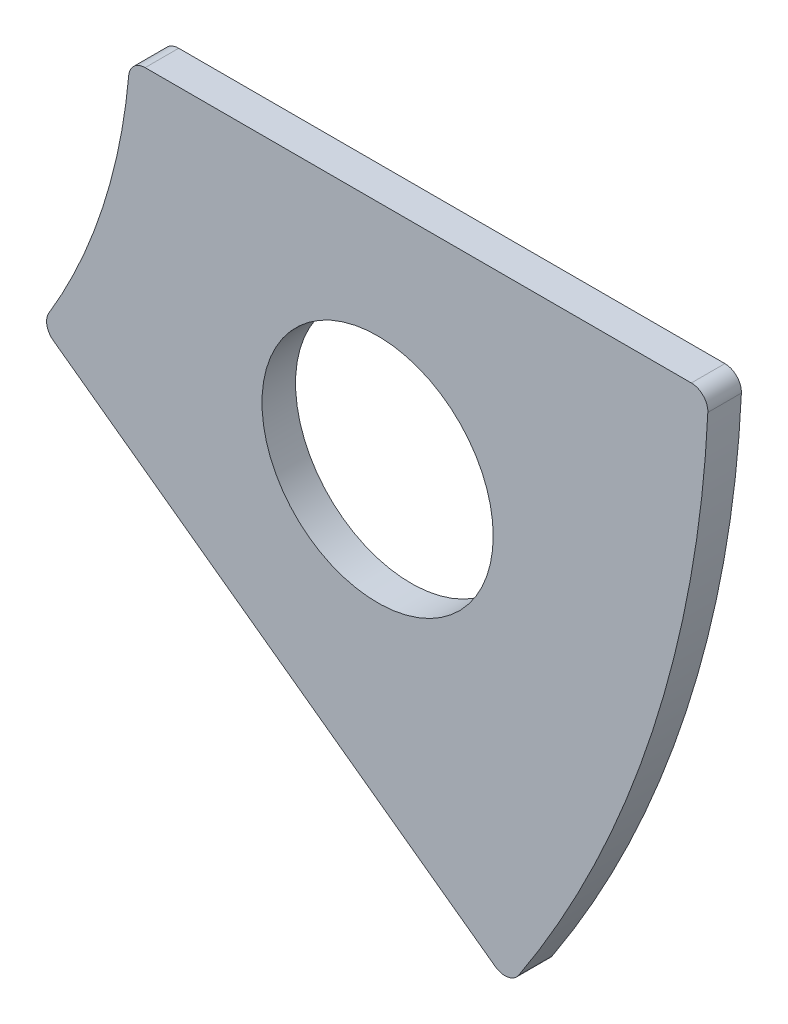
ISO-10303-21;
HEADER;
FILE_DESCRIPTION(('STEP AP214'),'2;1');
FILE_NAME('part.step','',(''),(''),'','','');
FILE_SCHEMA(('AUTOMOTIVE_DESIGN { 1 0 10303 214 1 1 1 1 }'));
ENDSEC;
DATA;
#1=APPLICATION_CONTEXT('core data for automotive mechanical design processes');
#2=APPLICATION_PROTOCOL_DEFINITION('international standard','automotive_design',2000,#1);
#3=PRODUCT_CONTEXT('',#1,'mechanical');
#4=PRODUCT('Part','Part','',(#3));
#5=PRODUCT_RELATED_PRODUCT_CATEGORY('part','',(#4));
#6=PRODUCT_DEFINITION_FORMATION('','',#4);
#7=PRODUCT_DEFINITION_CONTEXT('part definition',#1,'design');
#8=PRODUCT_DEFINITION('design','',#6,#7);
#9=PRODUCT_DEFINITION_SHAPE('','',#8);
#10=(LENGTH_UNIT() NAMED_UNIT(*) SI_UNIT(.MILLI.,.METRE.));
#11=(NAMED_UNIT(*) PLANE_ANGLE_UNIT() SI_UNIT($,.RADIAN.));
#12=(NAMED_UNIT(*) SI_UNIT($,.STERADIAN.) SOLID_ANGLE_UNIT());
#13=UNCERTAINTY_MEASURE_WITH_UNIT(LENGTH_MEASURE(1.E-05),#10,'distance_accuracy_value','');
#14=(GEOMETRIC_REPRESENTATION_CONTEXT(3) GLOBAL_UNCERTAINTY_ASSIGNED_CONTEXT((#13)) GLOBAL_UNIT_ASSIGNED_CONTEXT((#10,
#11,#12)) REPRESENTATION_CONTEXT('',''));
#15=CARTESIAN_POINT('',(0.,0.,0.));
#16=DIRECTION('',(0.,0.,1.));
#17=DIRECTION('',(1.,0.,0.));
#18=AXIS2_PLACEMENT_3D('',#15,#16,#17);
#19=CARTESIAN_POINT('',(0.,0.,1.016));
#20=DIRECTION('',(0.,0.,-1.));
#21=DIRECTION('',(-1.,0.,0.));
#22=AXIS2_PLACEMENT_3D('',#19,#20,#21);
#23=CYLINDRICAL_SURFACE('',#22,17.5);
#24=CARTESIAN_POINT('',(0.,0.,0.));
#25=DIRECTION('',(0.,0.,-1.));
#26=DIRECTION('',(1.,0.,0.));
#27=AXIS2_PLACEMENT_3D('',#24,#25,#26);
#28=CIRCLE('',#27,17.5);
#29=CARTESIAN_POINT('',(17.4307270907894,-1.55555555555556,0.));
#30=VERTEX_POINT('',#29);
#31=CARTESIAN_POINT('',(15.0160870554376,-8.98705344056212,0.));
#32=VERTEX_POINT('',#31);
#33=EDGE_CURVE('E137',#30,#32,#28,.T.);
#34=ORIENTED_EDGE('',*,*,#33,.T.);
#35=DIRECTION('',(0.,0.,-1.));
#36=VECTOR('',#35,1.);
#37=CARTESIAN_POINT('',(15.0160870554376,-8.98705344056212,1.016));
#38=LINE('',#37,#36);
#39=CARTESIAN_POINT('',(15.0160870554376,-8.98705344056212,1.016));
#40=VERTEX_POINT('',#39);
#41=EDGE_CURVE('E112',#32,#40,#38,.F.);
#42=ORIENTED_EDGE('',*,*,#41,.T.);
#43=CARTESIAN_POINT('',(0.,0.,1.016));
#44=DIRECTION('',(0.,0.,-1.));
#45=DIRECTION('',(1.,0.,0.));
#46=AXIS2_PLACEMENT_3D('',#43,#44,#45);
#47=CIRCLE('',#46,17.5);
#48=CARTESIAN_POINT('',(17.4307270907894,-1.55555555555556,1.016));
#49=VERTEX_POINT('',#48);
#50=EDGE_CURVE('E151',#49,#40,#47,.T.);
#51=ORIENTED_EDGE('',*,*,#50,.F.);
#52=DIRECTION('',(0.,0.,-1.));
#53=VECTOR('',#52,1.);
#54=CARTESIAN_POINT('',(17.4307270907894,-1.55555555555556,1.016));
#55=LINE('',#54,#53);
#56=EDGE_CURVE('E118',#49,#30,#55,.T.);
#57=ORIENTED_EDGE('',*,*,#56,.T.);
#58=EDGE_LOOP('',(#34,#42,#51,#57));
#59=FACE_BOUND('',#58,.T.);
#60=ADVANCED_FACE('F40',(#59),#23,.F.);
#61=CARTESIAN_POINT('',(14.7763646247406,-9.37598253393826,1.016));
#62=DIRECTION('',(0.587785252292474,0.809016994374946,0.));
#63=DIRECTION('',(-0.809016994374946,0.587785252292474,0.));
#64=AXIS2_PLACEMENT_3D('',#61,#62,#63);
#65=PLANE('',#64);
#66=DIRECTION('',(0.809016994374946,-0.587785252292474,0.));
#67=VECTOR('',#66,1.);
#68=CARTESIAN_POINT('',(14.7763646247406,-9.37598253393826,1.016));
#69=LINE('',#68,#67);
#70=CARTESIAN_POINT('',(15.1512254880182,-9.64833489319423,1.016));
#71=VERTEX_POINT('',#70);
#72=CARTESIAN_POINT('',(28.5276182235894,-19.3668530868887,1.016));
#73=VERTEX_POINT('',#72);
#74=EDGE_CURVE('E128',#71,#73,#69,.T.);
#75=ORIENTED_EDGE('',*,*,#74,.F.);
#76=DIRECTION('',(0.,0.,-1.));
#77=VECTOR('',#76,1.);
#78=CARTESIAN_POINT('',(15.1512254880182,-9.64833489319423,1.016));
#79=LINE('',#78,#77);
#80=CARTESIAN_POINT('',(15.1512254880182,-9.64833489319423,0.));
#81=VERTEX_POINT('',#80);
#82=EDGE_CURVE('E111',#71,#81,#79,.T.);
#83=ORIENTED_EDGE('',*,*,#82,.T.);
#84=DIRECTION('',(0.809016994374946,-0.587785252292474,0.));
#85=VECTOR('',#84,1.);
#86=CARTESIAN_POINT('',(14.7763646247406,-9.37598253393826,0.));
#87=LINE('',#86,#85);
#88=CARTESIAN_POINT('',(28.5276182235894,-19.3668530868887,0.));
#89=VERTEX_POINT('',#88);
#90=EDGE_CURVE('E125',#81,#89,#87,.T.);
#91=ORIENTED_EDGE('',*,*,#90,.T.);
#92=DIRECTION('',(0.,0.,-1.));
#93=VECTOR('',#92,1.);
#94=CARTESIAN_POINT('',(28.5276182235894,-19.3668530868887,1.016));
#95=LINE('',#94,#93);
#96=EDGE_CURVE('E131',#89,#73,#95,.F.);
#97=ORIENTED_EDGE('',*,*,#96,.T.);
#98=EDGE_LOOP('',(#75,#83,#91,#97));
#99=FACE_BOUND('',#98,.T.);
#100=ADVANCED_FACE('F124',(#99),#65,.F.);
#101=CARTESIAN_POINT('',(0.,0.,1.016));
#102=DIRECTION('',(0.,0.,-1.));
#103=DIRECTION('',(-1.,0.,0.));
#104=AXIS2_PLACEMENT_3D('',#101,#102,#103);
#105=CYLINDRICAL_SURFACE('',#104,35.);
#106=CARTESIAN_POINT('',(0.,0.,0.));
#107=DIRECTION('',(0.,0.,1.));
#108=DIRECTION('',(1.,0.,0.));
#109=AXIS2_PLACEMENT_3D('',#106,#107,#108);
#110=CIRCLE('',#109,35.);
#111=CARTESIAN_POINT('',(29.2392139055289,-19.2371611779578,0.));
#112=VERTEX_POINT('',#111);
#113=CARTESIAN_POINT('',(34.962340588114,-1.6231884057971,0.));
#114=VERTEX_POINT('',#113);
#115=EDGE_CURVE('E136',#112,#114,#110,.T.);
#116=ORIENTED_EDGE('',*,*,#115,.T.);
#117=DIRECTION('',(0.,0.,-1.));
#118=VECTOR('',#117,1.);
#119=CARTESIAN_POINT('',(34.962340588114,-1.6231884057971,1.016));
#120=LINE('',#119,#118);
#121=CARTESIAN_POINT('',(34.962340588114,-1.6231884057971,1.016));
#122=VERTEX_POINT('',#121);
#123=EDGE_CURVE('E11',#114,#122,#120,.F.);
#124=ORIENTED_EDGE('',*,*,#123,.T.);
#125=CARTESIAN_POINT('',(0.,0.,1.016));
#126=DIRECTION('',(0.,0.,1.));
#127=DIRECTION('',(1.,0.,0.));
#128=AXIS2_PLACEMENT_3D('',#125,#126,#127);
#129=CIRCLE('',#128,35.);
#130=CARTESIAN_POINT('',(29.2392139055289,-19.2371611779578,1.016));
#131=VERTEX_POINT('',#130);
#132=EDGE_CURVE('E191',#131,#122,#129,.T.);
#133=ORIENTED_EDGE('',*,*,#132,.F.);
#134=DIRECTION('',(0.,0.,-1.));
#135=VECTOR('',#134,1.);
#136=CARTESIAN_POINT('',(29.2392139055289,-19.2371611779578,1.016));
#137=LINE('',#136,#135);
#138=EDGE_CURVE('E49',#131,#112,#137,.T.);
#139=ORIENTED_EDGE('',*,*,#138,.T.);
#140=EDGE_LOOP('',(#116,#124,#133,#139));
#141=FACE_BOUND('',#140,.T.);
#142=ADVANCED_FACE('F189',(#141),#105,.T.);
#143=CARTESIAN_POINT('',(17.4653943556966,-1.1,1.016));
#144=DIRECTION('',(0.,-1.,0.));
#145=DIRECTION('',(0.,0.,-1.));
#146=AXIS2_PLACEMENT_3D('',#143,#144,#145);
#147=PLANE('',#146);
#148=DIRECTION('',(-1.,0.,0.));
#149=VECTOR('',#148,1.);
#150=CARTESIAN_POINT('',(17.4653943556966,-1.1,0.));
#151=LINE('',#150,#149);
#152=CARTESIAN_POINT('',(34.4628785797124,-1.1,0.));
#153=VERTEX_POINT('',#152);
#154=CARTESIAN_POINT('',(17.928747864812,-1.1,0.));
#155=VERTEX_POINT('',#154);
#156=EDGE_CURVE('E143',#153,#155,#151,.T.);
#157=ORIENTED_EDGE('',*,*,#156,.T.);
#158=DIRECTION('',(0.,0.,-1.));
#159=VECTOR('',#158,1.);
#160=CARTESIAN_POINT('',(17.928747864812,-1.1,1.016));
#161=LINE('',#160,#159);
#162=CARTESIAN_POINT('',(17.928747864812,-1.1,1.016));
#163=VERTEX_POINT('',#162);
#164=EDGE_CURVE('E56',#155,#163,#161,.F.);
#165=ORIENTED_EDGE('',*,*,#164,.T.);
#166=DIRECTION('',(-1.,0.,0.));
#167=VECTOR('',#166,1.);
#168=CARTESIAN_POINT('',(17.4653943556966,-1.1,1.016));
#169=LINE('',#168,#167);
#170=CARTESIAN_POINT('',(34.4628785797124,-1.1,1.016));
#171=VERTEX_POINT('',#170);
#172=EDGE_CURVE('E153',#171,#163,#169,.T.);
#173=ORIENTED_EDGE('',*,*,#172,.F.);
#174=DIRECTION('',(0.,0.,-1.));
#175=VECTOR('',#174,1.);
#176=CARTESIAN_POINT('',(34.4628785797124,-1.1,1.016));
#177=LINE('',#176,#175);
#178=EDGE_CURVE('E178',#171,#153,#177,.T.);
#179=ORIENTED_EDGE('',*,*,#178,.T.);
#180=EDGE_LOOP('',(#157,#165,#173,#179));
#181=FACE_BOUND('',#180,.T.);
#182=ADVANCED_FACE('F198',(#181),#147,.F.);
#183=CARTESIAN_POINT('',(0.,0.,1.016));
#184=DIRECTION('',(0.,0.,1.));
#185=DIRECTION('',(1.,0.,0.));
#186=AXIS2_PLACEMENT_3D('',#183,#184,#185);
#187=PLANE('',#186);
#188=CARTESIAN_POINT('',(24.9652335527478,-8.11169610234239,1.016));
#189=DIRECTION('',(0.,0.,1.));
#190=DIRECTION('',(1.,0.,0.));
#191=AXIS2_PLACEMENT_3D('',#188,#189,#190);
#192=CIRCLE('',#191,3.5);
#193=CARTESIAN_POINT('',(28.4652335527478,-8.11169610234239,1.016));
#194=VERTEX_POINT('',#193);
#195=EDGE_CURVE('E213',#194,#194,#192,.T.);
#196=ORIENTED_EDGE('',*,*,#195,.F.);
#197=EDGE_LOOP('',(#196));
#198=FACE_BOUND('',#197,.T.);
#199=ORIENTED_EDGE('',*,*,#50,.T.);
#200=CARTESIAN_POINT('',(15.4451181141644,-9.24382639600675,1.016));
#201=DIRECTION('',(0.,0.,1.));
#202=DIRECTION('',(1.,0.,0.));
#203=AXIS2_PLACEMENT_3D('',#200,#201,#202);
#204=CIRCLE('',#203,0.5);
#205=EDGE_CURVE('E175',#40,#71,#204,.T.);
#206=ORIENTED_EDGE('',*,*,#205,.T.);
#207=ORIENTED_EDGE('',*,*,#74,.T.);
#208=CARTESIAN_POINT('',(28.8215108497356,-18.9623445897013,1.016));
#209=DIRECTION('',(0.,0.,1.));
#210=DIRECTION('',(1.,0.,0.));
#211=AXIS2_PLACEMENT_3D('',#208,#209,#210);
#212=CIRCLE('',#211,0.5);
#213=EDGE_CURVE('E167',#73,#131,#212,.T.);
#214=ORIENTED_EDGE('',*,*,#213,.T.);
#215=ORIENTED_EDGE('',*,*,#132,.T.);
#216=CARTESIAN_POINT('',(34.4628785797124,-1.6,1.016));
#217=DIRECTION('',(0.,0.,1.));
#218=DIRECTION('',(1.,0.,0.));
#219=AXIS2_PLACEMENT_3D('',#216,#217,#218);
#220=CIRCLE('',#219,0.5);
#221=EDGE_CURVE('E63',#122,#171,#220,.T.);
#222=ORIENTED_EDGE('',*,*,#221,.T.);
#223=ORIENTED_EDGE('',*,*,#172,.T.);
#224=CARTESIAN_POINT('',(17.928747864812,-1.6,1.016));
#225=DIRECTION('',(0.,0.,1.));
#226=DIRECTION('',(1.,0.,0.));
#227=AXIS2_PLACEMENT_3D('',#224,#225,#226);
#228=CIRCLE('',#227,0.5);
#229=EDGE_CURVE('E172',#163,#49,#228,.T.);
#230=ORIENTED_EDGE('',*,*,#229,.T.);
#231=EDGE_LOOP('',(#199,#206,#207,#214,#215,#222,#223,#230));
#232=FACE_BOUND('',#231,.T.);
#233=ADVANCED_FACE('F221',(#198,#232),#187,.T.);
#234=CARTESIAN_POINT('',(0.,0.,0.));
#235=DIRECTION('',(0.,0.,1.));
#236=DIRECTION('',(1.,0.,0.));
#237=AXIS2_PLACEMENT_3D('',#234,#235,#236);
#238=PLANE('',#237);
#239=CARTESIAN_POINT('',(24.9652335527478,-8.11169610234239,0.));
#240=DIRECTION('',(0.,0.,1.));
#241=DIRECTION('',(1.,0.,0.));
#242=AXIS2_PLACEMENT_3D('',#239,#240,#241);
#243=CIRCLE('',#242,3.5);
#244=CARTESIAN_POINT('',(28.4652335527478,-8.11169610234239,0.));
#245=VERTEX_POINT('',#244);
#246=EDGE_CURVE('E145',#245,#245,#243,.T.);
#247=ORIENTED_EDGE('',*,*,#246,.T.);
#248=EDGE_LOOP('',(#247));
#249=FACE_BOUND('',#248,.T.);
#250=ORIENTED_EDGE('',*,*,#90,.F.);
#251=CARTESIAN_POINT('',(15.4451181141644,-9.24382639600675,0.));
#252=DIRECTION('',(0.,0.,1.));
#253=DIRECTION('',(1.,0.,0.));
#254=AXIS2_PLACEMENT_3D('',#251,#252,#253);
#255=CIRCLE('',#254,0.5);
#256=EDGE_CURVE('E107',#81,#32,#255,.F.);
#257=ORIENTED_EDGE('',*,*,#256,.T.);
#258=ORIENTED_EDGE('',*,*,#33,.F.);
#259=CARTESIAN_POINT('',(17.928747864812,-1.6,0.));
#260=DIRECTION('',(0.,0.,1.));
#261=DIRECTION('',(1.,0.,0.));
#262=AXIS2_PLACEMENT_3D('',#259,#260,#261);
#263=CIRCLE('',#262,0.5);
#264=EDGE_CURVE('E119',#30,#155,#263,.F.);
#265=ORIENTED_EDGE('',*,*,#264,.T.);
#266=ORIENTED_EDGE('',*,*,#156,.F.);
#267=CARTESIAN_POINT('',(34.4628785797124,-1.6,0.));
#268=DIRECTION('',(0.,0.,1.));
#269=DIRECTION('',(1.,0.,0.));
#270=AXIS2_PLACEMENT_3D('',#267,#268,#269);
#271=CIRCLE('',#270,0.5);
#272=EDGE_CURVE('E157',#153,#114,#271,.F.);
#273=ORIENTED_EDGE('',*,*,#272,.T.);
#274=ORIENTED_EDGE('',*,*,#115,.F.);
#275=CARTESIAN_POINT('',(28.8215108497356,-18.9623445897013,0.));
#276=DIRECTION('',(0.,0.,1.));
#277=DIRECTION('',(1.,0.,0.));
#278=AXIS2_PLACEMENT_3D('',#275,#276,#277);
#279=CIRCLE('',#278,0.5);
#280=EDGE_CURVE('E130',#112,#89,#279,.F.);
#281=ORIENTED_EDGE('',*,*,#280,.T.);
#282=EDGE_LOOP('',(#250,#257,#258,#265,#266,#273,#274,#281));
#283=FACE_BOUND('',#282,.T.);
#284=ADVANCED_FACE('F133',(#249,#283),#238,.F.);
#285=CARTESIAN_POINT('',(24.9652335527478,-8.11169610234239,1.016));
#286=DIRECTION('',(0.,0.,1.));
#287=DIRECTION('',(1.,0.,0.));
#288=AXIS2_PLACEMENT_3D('',#285,#286,#287);
#289=CYLINDRICAL_SURFACE('',#288,3.5);
#290=ORIENTED_EDGE('',*,*,#246,.F.);
#291=EDGE_LOOP('',(#290));
#292=FACE_BOUND('',#291,.T.);
#293=ORIENTED_EDGE('',*,*,#195,.T.);
#294=EDGE_LOOP('',(#293));
#295=FACE_BOUND('',#294,.T.);
#296=ADVANCED_FACE('F219',(#292,#295),#289,.F.);
#297=CARTESIAN_POINT('',(15.4451181141644,-9.24382639600675,1.016));
#298=DIRECTION('',(0.,0.,-1.));
#299=DIRECTION('',(-1.,0.,0.));
#300=AXIS2_PLACEMENT_3D('',#297,#298,#299);
#301=CYLINDRICAL_SURFACE('',#300,0.5);
#302=ORIENTED_EDGE('',*,*,#205,.F.);
#303=ORIENTED_EDGE('',*,*,#41,.F.);
#304=ORIENTED_EDGE('',*,*,#256,.F.);
#305=ORIENTED_EDGE('',*,*,#82,.F.);
#306=EDGE_LOOP('',(#302,#303,#304,#305));
#307=FACE_BOUND('',#306,.T.);
#308=ADVANCED_FACE('F110',(#307),#301,.T.);
#309=CARTESIAN_POINT('',(17.928747864812,-1.6,1.016));
#310=DIRECTION('',(0.,0.,-1.));
#311=DIRECTION('',(-1.,0.,0.));
#312=AXIS2_PLACEMENT_3D('',#309,#310,#311);
#313=CYLINDRICAL_SURFACE('',#312,0.5);
#314=ORIENTED_EDGE('',*,*,#229,.F.);
#315=ORIENTED_EDGE('',*,*,#164,.F.);
#316=ORIENTED_EDGE('',*,*,#264,.F.);
#317=ORIENTED_EDGE('',*,*,#56,.F.);
#318=EDGE_LOOP('',(#314,#315,#316,#317));
#319=FACE_BOUND('',#318,.T.);
#320=ADVANCED_FACE('F228',(#319),#313,.T.);
#321=CARTESIAN_POINT('',(34.4628785797124,-1.6,1.016));
#322=DIRECTION('',(0.,0.,-1.));
#323=DIRECTION('',(-1.,0.,0.));
#324=AXIS2_PLACEMENT_3D('',#321,#322,#323);
#325=CYLINDRICAL_SURFACE('',#324,0.5);
#326=ORIENTED_EDGE('',*,*,#221,.F.);
#327=ORIENTED_EDGE('',*,*,#123,.F.);
#328=ORIENTED_EDGE('',*,*,#272,.F.);
#329=ORIENTED_EDGE('',*,*,#178,.F.);
#330=EDGE_LOOP('',(#326,#327,#328,#329));
#331=FACE_BOUND('',#330,.T.);
#332=ADVANCED_FACE('F197',(#331),#325,.T.);
#333=CARTESIAN_POINT('',(28.8215108497356,-18.9623445897013,1.016));
#334=DIRECTION('',(0.,0.,-1.));
#335=DIRECTION('',(-1.,0.,0.));
#336=AXIS2_PLACEMENT_3D('',#333,#334,#335);
#337=CYLINDRICAL_SURFACE('',#336,0.5);
#338=ORIENTED_EDGE('',*,*,#213,.F.);
#339=ORIENTED_EDGE('',*,*,#96,.F.);
#340=ORIENTED_EDGE('',*,*,#280,.F.);
#341=ORIENTED_EDGE('',*,*,#138,.F.);
#342=EDGE_LOOP('',(#338,#339,#340,#341));
#343=FACE_BOUND('',#342,.T.);
#344=ADVANCED_FACE('F42',(#343),#337,.T.);
#345=CLOSED_SHELL('',(#60,#100,#142,#182,#233,#284,#296,#308,#320,#332,#344));
#346=MANIFOLD_SOLID_BREP('B2',#345);
#347=ADVANCED_BREP_SHAPE_REPRESENTATION('',(#18,#346),#14);
#348=SHAPE_DEFINITION_REPRESENTATION(#9,#347);
ENDSEC;
END-ISO-10303-21;
